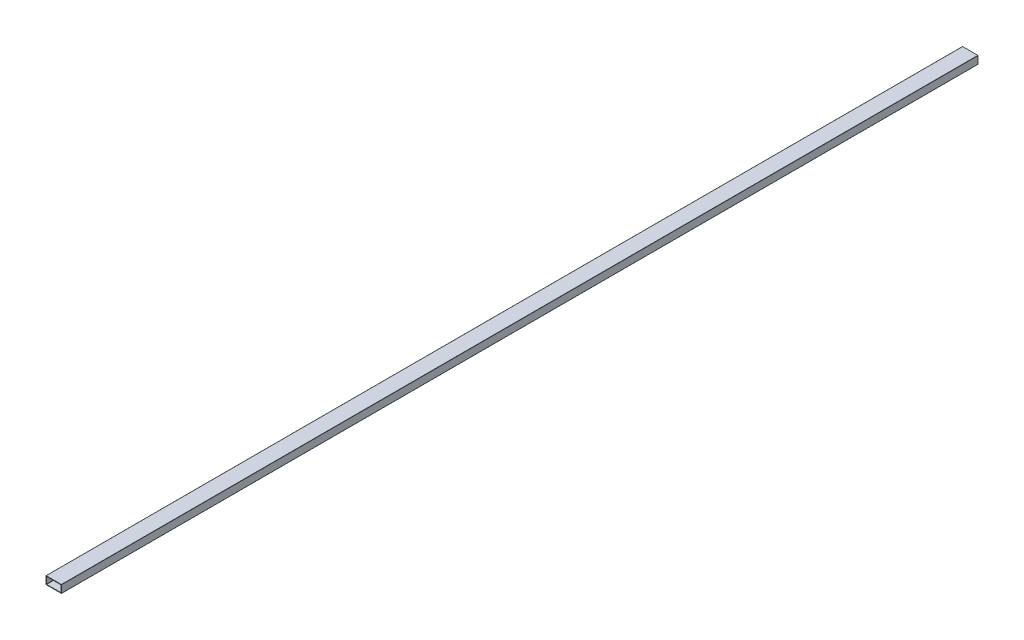
ISO-10303-21;
HEADER;
FILE_DESCRIPTION(('STEP AP214'),'2;1');
FILE_NAME('part.step','',(''),(''),'','','');
FILE_SCHEMA(('AUTOMOTIVE_DESIGN { 1 0 10303 214 1 1 1 1 }'));
ENDSEC;
DATA;
#1=APPLICATION_CONTEXT('core data for automotive mechanical design processes');
#2=APPLICATION_PROTOCOL_DEFINITION('international standard','automotive_design',2000,#1);
#3=PRODUCT_CONTEXT('',#1,'mechanical');
#4=PRODUCT('Part','Part','',(#3));
#5=PRODUCT_RELATED_PRODUCT_CATEGORY('part','',(#4));
#6=PRODUCT_DEFINITION_FORMATION('','',#4);
#7=PRODUCT_DEFINITION_CONTEXT('part definition',#1,'design');
#8=PRODUCT_DEFINITION('design','',#6,#7);
#9=PRODUCT_DEFINITION_SHAPE('','',#8);
#10=(LENGTH_UNIT() NAMED_UNIT(*) SI_UNIT(.MILLI.,.METRE.));
#11=(NAMED_UNIT(*) PLANE_ANGLE_UNIT() SI_UNIT($,.RADIAN.));
#12=(NAMED_UNIT(*) SI_UNIT($,.STERADIAN.) SOLID_ANGLE_UNIT());
#13=UNCERTAINTY_MEASURE_WITH_UNIT(LENGTH_MEASURE(1.E-05),#10,'distance_accuracy_value','');
#14=(GEOMETRIC_REPRESENTATION_CONTEXT(3) GLOBAL_UNCERTAINTY_ASSIGNED_CONTEXT((#13)) GLOBAL_UNIT_ASSIGNED_CONTEXT((#10,
#11,#12)) REPRESENTATION_CONTEXT('',''));
#15=CARTESIAN_POINT('',(0.,0.,0.));
#16=DIRECTION('',(0.,0.,1.));
#17=DIRECTION('',(1.,0.,0.));
#18=AXIS2_PLACEMENT_3D('',#15,#16,#17);
#19=CARTESIAN_POINT('',(50.8,-25.4,-6000.));
#20=DIRECTION('',(1.,0.,0.));
#21=DIRECTION('',(0.,0.,-1.));
#22=AXIS2_PLACEMENT_3D('',#19,#20,#21);
#23=PLANE('',#22);
#24=DIRECTION('',(0.,1.,0.));
#25=VECTOR('',#24,1.);
#26=CARTESIAN_POINT('',(50.8,-25.4,0.));
#27=LINE('',#26,#25);
#28=CARTESIAN_POINT('',(50.8,-24.4,0.));
#29=VERTEX_POINT('',#28);
#30=CARTESIAN_POINT('',(50.8,24.4,0.));
#31=VERTEX_POINT('',#30);
#32=EDGE_CURVE('E197',#29,#31,#27,.T.);
#33=ORIENTED_EDGE('',*,*,#32,.F.);
#34=DIRECTION('',(0.,0.,1.));
#35=VECTOR('',#34,1.);
#36=CARTESIAN_POINT('',(50.8,-24.4,-6000.));
#37=LINE('',#36,#35);
#38=CARTESIAN_POINT('',(50.8,-24.4,-6000.));
#39=VERTEX_POINT('',#38);
#40=EDGE_CURVE('E158',#29,#39,#37,.F.);
#41=ORIENTED_EDGE('',*,*,#40,.T.);
#42=DIRECTION('',(0.,1.,0.));
#43=VECTOR('',#42,1.);
#44=CARTESIAN_POINT('',(50.8,-25.4,-6000.));
#45=LINE('',#44,#43);
#46=CARTESIAN_POINT('',(50.8,24.4,-6000.));
#47=VERTEX_POINT('',#46);
#48=EDGE_CURVE('E185',#39,#47,#45,.T.);
#49=ORIENTED_EDGE('',*,*,#48,.T.);
#50=DIRECTION('',(0.,0.,1.));
#51=VECTOR('',#50,1.);
#52=CARTESIAN_POINT('',(50.8,24.4,-6000.));
#53=LINE('',#52,#51);
#54=EDGE_CURVE('E251',#47,#31,#53,.T.);
#55=ORIENTED_EDGE('',*,*,#54,.T.);
#56=EDGE_LOOP('',(#33,#41,#49,#55));
#57=FACE_BOUND('',#56,.T.);
#58=ADVANCED_FACE('F33',(#57),#23,.T.);
#59=CARTESIAN_POINT('',(-50.8,-25.4,-6000.));
#60=DIRECTION('',(0.,-1.,0.));
#61=DIRECTION('',(0.,0.,-1.));
#62=AXIS2_PLACEMENT_3D('',#59,#60,#61);
#63=PLANE('',#62);
#64=DIRECTION('',(1.,0.,0.));
#65=VECTOR('',#64,1.);
#66=CARTESIAN_POINT('',(-50.8,-25.4,0.));
#67=LINE('',#66,#65);
#68=CARTESIAN_POINT('',(-49.8,-25.4,0.));
#69=VERTEX_POINT('',#68);
#70=CARTESIAN_POINT('',(49.8,-25.4,0.));
#71=VERTEX_POINT('',#70);
#72=EDGE_CURVE('E189',#69,#71,#67,.T.);
#73=ORIENTED_EDGE('',*,*,#72,.F.);
#74=DIRECTION('',(0.,0.,1.));
#75=VECTOR('',#74,1.);
#76=CARTESIAN_POINT('',(-49.8,-25.4,-6000.));
#77=LINE('',#76,#75);
#78=CARTESIAN_POINT('',(-49.8,-25.4,-6000.));
#79=VERTEX_POINT('',#78);
#80=EDGE_CURVE('E238',#69,#79,#77,.F.);
#81=ORIENTED_EDGE('',*,*,#80,.T.);
#82=DIRECTION('',(1.,0.,0.));
#83=VECTOR('',#82,1.);
#84=CARTESIAN_POINT('',(-50.8,-25.4,-6000.));
#85=LINE('',#84,#83);
#86=CARTESIAN_POINT('',(49.8,-25.4,-6000.));
#87=VERTEX_POINT('',#86);
#88=EDGE_CURVE('E194',#79,#87,#85,.T.);
#89=ORIENTED_EDGE('',*,*,#88,.T.);
#90=DIRECTION('',(0.,0.,1.));
#91=VECTOR('',#90,1.);
#92=CARTESIAN_POINT('',(49.8,-25.4,-6000.));
#93=LINE('',#92,#91);
#94=EDGE_CURVE('E235',#87,#71,#93,.T.);
#95=ORIENTED_EDGE('',*,*,#94,.T.);
#96=EDGE_LOOP('',(#73,#81,#89,#95));
#97=FACE_BOUND('',#96,.T.);
#98=ADVANCED_FACE('F305',(#97),#63,.T.);
#99=CARTESIAN_POINT('',(-50.8,-25.4,-6000.));
#100=DIRECTION('',(-1.,0.,0.));
#101=DIRECTION('',(0.,0.,1.));
#102=AXIS2_PLACEMENT_3D('',#99,#100,#101);
#103=PLANE('',#102);
#104=DIRECTION('',(0.,-1.,0.));
#105=VECTOR('',#104,1.);
#106=CARTESIAN_POINT('',(-50.8,-25.4,-6000.));
#107=LINE('',#106,#105);
#108=CARTESIAN_POINT('',(-50.8,24.4,-6000.));
#109=VERTEX_POINT('',#108);
#110=CARTESIAN_POINT('',(-50.8,-24.4,-6000.));
#111=VERTEX_POINT('',#110);
#112=EDGE_CURVE('E191',#109,#111,#107,.T.);
#113=ORIENTED_EDGE('',*,*,#112,.T.);
#114=DIRECTION('',(0.,0.,1.));
#115=VECTOR('',#114,1.);
#116=CARTESIAN_POINT('',(-50.8,-24.4,-6000.));
#117=LINE('',#116,#115);
#118=CARTESIAN_POINT('',(-50.8,-24.4,0.));
#119=VERTEX_POINT('',#118);
#120=EDGE_CURVE('E224',#111,#119,#117,.T.);
#121=ORIENTED_EDGE('',*,*,#120,.T.);
#122=DIRECTION('',(0.,-1.,0.));
#123=VECTOR('',#122,1.);
#124=CARTESIAN_POINT('',(-50.8,-25.4,0.));
#125=LINE('',#124,#123);
#126=CARTESIAN_POINT('',(-50.8,24.4,0.));
#127=VERTEX_POINT('',#126);
#128=EDGE_CURVE('E203',#127,#119,#125,.T.);
#129=ORIENTED_EDGE('',*,*,#128,.F.);
#130=DIRECTION('',(0.,0.,1.));
#131=VECTOR('',#130,1.);
#132=CARTESIAN_POINT('',(-50.8,24.4,-6000.));
#133=LINE('',#132,#131);
#134=EDGE_CURVE('E222',#127,#109,#133,.F.);
#135=ORIENTED_EDGE('',*,*,#134,.T.);
#136=EDGE_LOOP('',(#113,#121,#129,#135));
#137=FACE_BOUND('',#136,.T.);
#138=ADVANCED_FACE('F311',(#137),#103,.T.);
#139=CARTESIAN_POINT('',(-50.8,25.4,-6000.));
#140=DIRECTION('',(0.,1.,0.));
#141=DIRECTION('',(0.,0.,1.));
#142=AXIS2_PLACEMENT_3D('',#139,#140,#141);
#143=PLANE('',#142);
#144=DIRECTION('',(-1.,0.,0.));
#145=VECTOR('',#144,1.);
#146=CARTESIAN_POINT('',(-50.8,25.4,-6000.));
#147=LINE('',#146,#145);
#148=CARTESIAN_POINT('',(49.8,25.4,-6000.));
#149=VERTEX_POINT('',#148);
#150=CARTESIAN_POINT('',(-49.8,25.4,-6000.));
#151=VERTEX_POINT('',#150);
#152=EDGE_CURVE('E188',#149,#151,#147,.T.);
#153=ORIENTED_EDGE('',*,*,#152,.T.);
#154=DIRECTION('',(0.,0.,1.));
#155=VECTOR('',#154,1.);
#156=CARTESIAN_POINT('',(-49.8,25.4,-6000.));
#157=LINE('',#156,#155);
#158=CARTESIAN_POINT('',(-49.8,25.4,0.));
#159=VERTEX_POINT('',#158);
#160=EDGE_CURVE('E248',#151,#159,#157,.T.);
#161=ORIENTED_EDGE('',*,*,#160,.T.);
#162=DIRECTION('',(-1.,0.,0.));
#163=VECTOR('',#162,1.);
#164=CARTESIAN_POINT('',(-50.8,25.4,0.));
#165=LINE('',#164,#163);
#166=CARTESIAN_POINT('',(49.8,25.4,0.));
#167=VERTEX_POINT('',#166);
#168=EDGE_CURVE('E200',#167,#159,#165,.T.);
#169=ORIENTED_EDGE('',*,*,#168,.F.);
#170=DIRECTION('',(0.,0.,1.));
#171=VECTOR('',#170,1.);
#172=CARTESIAN_POINT('',(49.8,25.4,-6000.));
#173=LINE('',#172,#171);
#174=EDGE_CURVE('E55',#167,#149,#173,.F.);
#175=ORIENTED_EDGE('',*,*,#174,.T.);
#176=EDGE_LOOP('',(#153,#161,#169,#175));
#177=FACE_BOUND('',#176,.T.);
#178=ADVANCED_FACE('F316',(#177),#143,.T.);
#179=CARTESIAN_POINT('',(0.,0.,-6000.));
#180=DIRECTION('',(0.,0.,-1.));
#181=DIRECTION('',(-1.,0.,0.));
#182=AXIS2_PLACEMENT_3D('',#179,#180,#181);
#183=PLANE('',#182);
#184=DIRECTION('',(0.,-1.,0.));
#185=VECTOR('',#184,1.);
#186=CARTESIAN_POINT('',(-47.76,-22.36,-6000.));
#187=LINE('',#186,#185);
#188=CARTESIAN_POINT('',(-47.76,21.36,-6000.));
#189=VERTEX_POINT('',#188);
#190=CARTESIAN_POINT('',(-47.76,-21.36,-6000.));
#191=VERTEX_POINT('',#190);
#192=EDGE_CURVE('E167',#189,#191,#187,.T.);
#193=ORIENTED_EDGE('',*,*,#192,.T.);
#194=CARTESIAN_POINT('',(-46.76,-21.36,-6000.));
#195=DIRECTION('',(0.,0.,-1.));
#196=DIRECTION('',(-1.,0.,0.));
#197=AXIS2_PLACEMENT_3D('',#194,#195,#196);
#198=CIRCLE('',#197,1.);
#199=CARTESIAN_POINT('',(-46.76,-22.36,-6000.));
#200=VERTEX_POINT('',#199);
#201=EDGE_CURVE('E11',#191,#200,#198,.F.);
#202=ORIENTED_EDGE('',*,*,#201,.T.);
#203=DIRECTION('',(1.,0.,0.));
#204=VECTOR('',#203,1.);
#205=CARTESIAN_POINT('',(-47.76,-22.36,-6000.));
#206=LINE('',#205,#204);
#207=CARTESIAN_POINT('',(46.76,-22.36,-6000.));
#208=VERTEX_POINT('',#207);
#209=EDGE_CURVE('E175',#200,#208,#206,.T.);
#210=ORIENTED_EDGE('',*,*,#209,.T.);
#211=CARTESIAN_POINT('',(46.76,-21.36,-6000.));
#212=DIRECTION('',(0.,0.,-1.));
#213=DIRECTION('',(-1.,0.,0.));
#214=AXIS2_PLACEMENT_3D('',#211,#212,#213);
#215=CIRCLE('',#214,1.);
#216=CARTESIAN_POINT('',(47.76,-21.36,-6000.));
#217=VERTEX_POINT('',#216);
#218=EDGE_CURVE('E262',#208,#217,#215,.F.);
#219=ORIENTED_EDGE('',*,*,#218,.T.);
#220=DIRECTION('',(0.,1.,0.));
#221=VECTOR('',#220,1.);
#222=CARTESIAN_POINT('',(47.76,-22.36,-6000.));
#223=LINE('',#222,#221);
#224=CARTESIAN_POINT('',(47.76,21.36,-6000.));
#225=VERTEX_POINT('',#224);
#226=EDGE_CURVE('E179',#217,#225,#223,.T.);
#227=ORIENTED_EDGE('',*,*,#226,.T.);
#228=CARTESIAN_POINT('',(46.76,21.36,-6000.));
#229=DIRECTION('',(0.,0.,-1.));
#230=DIRECTION('',(-1.,0.,0.));
#231=AXIS2_PLACEMENT_3D('',#228,#229,#230);
#232=CIRCLE('',#231,1.);
#233=CARTESIAN_POINT('',(46.76,22.36,-6000.));
#234=VERTEX_POINT('',#233);
#235=EDGE_CURVE('E258',#225,#234,#232,.F.);
#236=ORIENTED_EDGE('',*,*,#235,.T.);
#237=DIRECTION('',(-1.,0.,0.));
#238=VECTOR('',#237,1.);
#239=CARTESIAN_POINT('',(-47.76,22.36,-6000.));
#240=LINE('',#239,#238);
#241=CARTESIAN_POINT('',(-46.76,22.36,-6000.));
#242=VERTEX_POINT('',#241);
#243=EDGE_CURVE('E277',#234,#242,#240,.T.);
#244=ORIENTED_EDGE('',*,*,#243,.T.);
#245=CARTESIAN_POINT('',(-46.76,21.36,-6000.));
#246=DIRECTION('',(0.,0.,-1.));
#247=DIRECTION('',(-1.,0.,0.));
#248=AXIS2_PLACEMENT_3D('',#245,#246,#247);
#249=CIRCLE('',#248,1.);
#250=EDGE_CURVE('E157',#242,#189,#249,.F.);
#251=ORIENTED_EDGE('',*,*,#250,.T.);
#252=EDGE_LOOP('',(#193,#202,#210,#219,#227,#236,#244,#251));
#253=FACE_BOUND('',#252,.T.);
#254=ORIENTED_EDGE('',*,*,#88,.F.);
#255=CARTESIAN_POINT('',(-49.8,-24.4,-6000.));
#256=DIRECTION('',(0.,0.,-1.));
#257=DIRECTION('',(-1.,0.,0.));
#258=AXIS2_PLACEMENT_3D('',#255,#256,#257);
#259=CIRCLE('',#258,1.);
#260=EDGE_CURVE('E245',#79,#111,#259,.T.);
#261=ORIENTED_EDGE('',*,*,#260,.T.);
#262=ORIENTED_EDGE('',*,*,#112,.F.);
#263=CARTESIAN_POINT('',(-49.8,24.4,-6000.));
#264=DIRECTION('',(0.,0.,-1.));
#265=DIRECTION('',(-1.,0.,0.));
#266=AXIS2_PLACEMENT_3D('',#263,#264,#265);
#267=CIRCLE('',#266,1.);
#268=EDGE_CURVE('E48',#109,#151,#267,.T.);
#269=ORIENTED_EDGE('',*,*,#268,.T.);
#270=ORIENTED_EDGE('',*,*,#152,.F.);
#271=CARTESIAN_POINT('',(49.8,24.4,-6000.));
#272=DIRECTION('',(0.,0.,-1.));
#273=DIRECTION('',(-1.,0.,0.));
#274=AXIS2_PLACEMENT_3D('',#271,#272,#273);
#275=CIRCLE('',#274,1.);
#276=EDGE_CURVE('E240',#149,#47,#275,.T.);
#277=ORIENTED_EDGE('',*,*,#276,.T.);
#278=ORIENTED_EDGE('',*,*,#48,.F.);
#279=CARTESIAN_POINT('',(49.8,-24.4,-6000.));
#280=DIRECTION('',(0.,0.,-1.));
#281=DIRECTION('',(-1.,0.,0.));
#282=AXIS2_PLACEMENT_3D('',#279,#280,#281);
#283=CIRCLE('',#282,1.);
#284=EDGE_CURVE('E242',#39,#87,#283,.T.);
#285=ORIENTED_EDGE('',*,*,#284,.T.);
#286=EDGE_LOOP('',(#254,#261,#262,#269,#270,#277,#278,#285));
#287=FACE_BOUND('',#286,.T.);
#288=ADVANCED_FACE('F267',(#253,#287),#183,.T.);
#289=CARTESIAN_POINT('',(0.,0.,0.));
#290=DIRECTION('',(0.,0.,-1.));
#291=DIRECTION('',(-1.,0.,0.));
#292=AXIS2_PLACEMENT_3D('',#289,#290,#291);
#293=PLANE('',#292);
#294=DIRECTION('',(0.,1.,0.));
#295=VECTOR('',#294,1.);
#296=CARTESIAN_POINT('',(47.76,-22.36,0.));
#297=LINE('',#296,#295);
#298=CARTESIAN_POINT('',(47.76,-21.36,0.));
#299=VERTEX_POINT('',#298);
#300=CARTESIAN_POINT('',(47.76,21.36,0.));
#301=VERTEX_POINT('',#300);
#302=EDGE_CURVE('E181',#299,#301,#297,.T.);
#303=ORIENTED_EDGE('',*,*,#302,.F.);
#304=CARTESIAN_POINT('',(46.76,-21.36,0.));
#305=DIRECTION('',(0.,0.,-1.));
#306=DIRECTION('',(-1.,0.,0.));
#307=AXIS2_PLACEMENT_3D('',#304,#305,#306);
#308=CIRCLE('',#307,1.);
#309=CARTESIAN_POINT('',(46.76,-22.36,0.));
#310=VERTEX_POINT('',#309);
#311=EDGE_CURVE('E260',#299,#310,#308,.T.);
#312=ORIENTED_EDGE('',*,*,#311,.T.);
#313=DIRECTION('',(1.,0.,0.));
#314=VECTOR('',#313,1.);
#315=CARTESIAN_POINT('',(-47.76,-22.36,0.));
#316=LINE('',#315,#314);
#317=CARTESIAN_POINT('',(-46.76,-22.36,0.));
#318=VERTEX_POINT('',#317);
#319=EDGE_CURVE('E281',#318,#310,#316,.T.);
#320=ORIENTED_EDGE('',*,*,#319,.F.);
#321=CARTESIAN_POINT('',(-46.76,-21.36,0.));
#322=DIRECTION('',(0.,0.,-1.));
#323=DIRECTION('',(-1.,0.,0.));
#324=AXIS2_PLACEMENT_3D('',#321,#322,#323);
#325=CIRCLE('',#324,1.);
#326=CARTESIAN_POINT('',(-47.76,-21.36,0.));
#327=VERTEX_POINT('',#326);
#328=EDGE_CURVE('E41',#318,#327,#325,.T.);
#329=ORIENTED_EDGE('',*,*,#328,.T.);
#330=DIRECTION('',(0.,-1.,0.));
#331=VECTOR('',#330,1.);
#332=CARTESIAN_POINT('',(-47.76,-22.36,0.));
#333=LINE('',#332,#331);
#334=CARTESIAN_POINT('',(-47.76,21.36,0.));
#335=VERTEX_POINT('',#334);
#336=EDGE_CURVE('E164',#335,#327,#333,.T.);
#337=ORIENTED_EDGE('',*,*,#336,.F.);
#338=CARTESIAN_POINT('',(-46.76,21.36,0.));
#339=DIRECTION('',(0.,0.,-1.));
#340=DIRECTION('',(-1.,0.,0.));
#341=AXIS2_PLACEMENT_3D('',#338,#339,#340);
#342=CIRCLE('',#341,1.);
#343=CARTESIAN_POINT('',(-46.76,22.36,0.));
#344=VERTEX_POINT('',#343);
#345=EDGE_CURVE('E147',#335,#344,#342,.T.);
#346=ORIENTED_EDGE('',*,*,#345,.T.);
#347=DIRECTION('',(-1.,0.,0.));
#348=VECTOR('',#347,1.);
#349=CARTESIAN_POINT('',(-47.76,22.36,0.));
#350=LINE('',#349,#348);
#351=CARTESIAN_POINT('',(46.76,22.36,0.));
#352=VERTEX_POINT('',#351);
#353=EDGE_CURVE('E176',#352,#344,#350,.T.);
#354=ORIENTED_EDGE('',*,*,#353,.F.);
#355=CARTESIAN_POINT('',(46.76,21.36,0.));
#356=DIRECTION('',(0.,0.,-1.));
#357=DIRECTION('',(-1.,0.,0.));
#358=AXIS2_PLACEMENT_3D('',#355,#356,#357);
#359=CIRCLE('',#358,1.);
#360=EDGE_CURVE('E256',#352,#301,#359,.T.);
#361=ORIENTED_EDGE('',*,*,#360,.T.);
#362=EDGE_LOOP('',(#303,#312,#320,#329,#337,#346,#354,#361));
#363=FACE_BOUND('',#362,.T.);
#364=ORIENTED_EDGE('',*,*,#128,.T.);
#365=CARTESIAN_POINT('',(-49.8,-24.4,0.));
#366=DIRECTION('',(0.,0.,-1.));
#367=DIRECTION('',(-1.,0.,0.));
#368=AXIS2_PLACEMENT_3D('',#365,#366,#367);
#369=CIRCLE('',#368,1.);
#370=EDGE_CURVE('E233',#119,#69,#369,.F.);
#371=ORIENTED_EDGE('',*,*,#370,.T.);
#372=ORIENTED_EDGE('',*,*,#72,.T.);
#373=CARTESIAN_POINT('',(49.8,-24.4,0.));
#374=DIRECTION('',(0.,0.,-1.));
#375=DIRECTION('',(-1.,0.,0.));
#376=AXIS2_PLACEMENT_3D('',#373,#374,#375);
#377=CIRCLE('',#376,1.);
#378=EDGE_CURVE('E229',#71,#29,#377,.F.);
#379=ORIENTED_EDGE('',*,*,#378,.T.);
#380=ORIENTED_EDGE('',*,*,#32,.T.);
#381=CARTESIAN_POINT('',(49.8,24.4,0.));
#382=DIRECTION('',(0.,0.,-1.));
#383=DIRECTION('',(-1.,0.,0.));
#384=AXIS2_PLACEMENT_3D('',#381,#382,#383);
#385=CIRCLE('',#384,1.);
#386=EDGE_CURVE('E227',#31,#167,#385,.F.);
#387=ORIENTED_EDGE('',*,*,#386,.T.);
#388=ORIENTED_EDGE('',*,*,#168,.T.);
#389=CARTESIAN_POINT('',(-49.8,24.4,0.));
#390=DIRECTION('',(0.,0.,-1.));
#391=DIRECTION('',(-1.,0.,0.));
#392=AXIS2_PLACEMENT_3D('',#389,#390,#391);
#393=CIRCLE('',#392,1.);
#394=EDGE_CURVE('E231',#159,#127,#393,.F.);
#395=ORIENTED_EDGE('',*,*,#394,.T.);
#396=EDGE_LOOP('',(#364,#371,#372,#379,#380,#387,#388,#395));
#397=FACE_BOUND('',#396,.T.);
#398=ADVANCED_FACE('F172',(#363,#397),#293,.F.);
#399=CARTESIAN_POINT('',(-47.76,-22.36,-6000.));
#400=DIRECTION('',(0.,-1.,0.));
#401=DIRECTION('',(0.,0.,-1.));
#402=AXIS2_PLACEMENT_3D('',#399,#400,#401);
#403=PLANE('',#402);
#404=ORIENTED_EDGE('',*,*,#319,.T.);
#405=DIRECTION('',(0.,0.,1.));
#406=VECTOR('',#405,1.);
#407=CARTESIAN_POINT('',(46.76,-22.36,-6000.));
#408=LINE('',#407,#406);
#409=EDGE_CURVE('E220',#310,#208,#408,.F.);
#410=ORIENTED_EDGE('',*,*,#409,.T.);
#411=ORIENTED_EDGE('',*,*,#209,.F.);
#412=DIRECTION('',(0.,0.,1.));
#413=VECTOR('',#412,1.);
#414=CARTESIAN_POINT('',(-46.76,-22.36,0.));
#415=LINE('',#414,#413);
#416=EDGE_CURVE('E217',#200,#318,#415,.T.);
#417=ORIENTED_EDGE('',*,*,#416,.T.);
#418=EDGE_LOOP('',(#404,#410,#411,#417));
#419=FACE_BOUND('',#418,.T.);
#420=ADVANCED_FACE('F283',(#419),#403,.F.);
#421=CARTESIAN_POINT('',(-47.76,-22.36,-6000.));
#422=DIRECTION('',(-1.,0.,0.));
#423=DIRECTION('',(0.,0.,1.));
#424=AXIS2_PLACEMENT_3D('',#421,#422,#423);
#425=PLANE('',#424);
#426=ORIENTED_EDGE('',*,*,#192,.F.);
#427=DIRECTION('',(0.,0.,1.));
#428=VECTOR('',#427,1.);
#429=CARTESIAN_POINT('',(-47.76,21.36,0.));
#430=LINE('',#429,#428);
#431=EDGE_CURVE('E151',#189,#335,#430,.T.);
#432=ORIENTED_EDGE('',*,*,#431,.T.);
#433=ORIENTED_EDGE('',*,*,#336,.T.);
#434=DIRECTION('',(0.,0.,1.));
#435=VECTOR('',#434,1.);
#436=CARTESIAN_POINT('',(-47.76,-21.36,-6000.));
#437=LINE('',#436,#435);
#438=EDGE_CURVE('E169',#327,#191,#437,.F.);
#439=ORIENTED_EDGE('',*,*,#438,.T.);
#440=EDGE_LOOP('',(#426,#432,#433,#439));
#441=FACE_BOUND('',#440,.T.);
#442=ADVANCED_FACE('F163',(#441),#425,.F.);
#443=CARTESIAN_POINT('',(-47.76,22.36,-6000.));
#444=DIRECTION('',(0.,1.,0.));
#445=DIRECTION('',(-1.,0.,0.));
#446=AXIS2_PLACEMENT_3D('',#443,#444,#445);
#447=PLANE('',#446);
#448=ORIENTED_EDGE('',*,*,#353,.T.);
#449=DIRECTION('',(0.,0.,1.));
#450=VECTOR('',#449,1.);
#451=CARTESIAN_POINT('',(-46.76,22.36,-6000.));
#452=LINE('',#451,#450);
#453=EDGE_CURVE('E152',#344,#242,#452,.F.);
#454=ORIENTED_EDGE('',*,*,#453,.T.);
#455=ORIENTED_EDGE('',*,*,#243,.F.);
#456=DIRECTION('',(0.,0.,1.));
#457=VECTOR('',#456,1.);
#458=CARTESIAN_POINT('',(46.76,22.36,0.));
#459=LINE('',#458,#457);
#460=EDGE_CURVE('E168',#234,#352,#459,.T.);
#461=ORIENTED_EDGE('',*,*,#460,.T.);
#462=EDGE_LOOP('',(#448,#454,#455,#461));
#463=FACE_BOUND('',#462,.T.);
#464=ADVANCED_FACE('F292',(#463),#447,.F.);
#465=CARTESIAN_POINT('',(47.76,-22.36,-6000.));
#466=DIRECTION('',(1.,0.,0.));
#467=DIRECTION('',(0.,0.,-1.));
#468=AXIS2_PLACEMENT_3D('',#465,#466,#467);
#469=PLANE('',#468);
#470=ORIENTED_EDGE('',*,*,#302,.T.);
#471=DIRECTION('',(0.,0.,1.));
#472=VECTOR('',#471,1.);
#473=CARTESIAN_POINT('',(47.76,21.36,-6000.));
#474=LINE('',#473,#472);
#475=EDGE_CURVE('E215',#301,#225,#474,.F.);
#476=ORIENTED_EDGE('',*,*,#475,.T.);
#477=ORIENTED_EDGE('',*,*,#226,.F.);
#478=DIRECTION('',(0.,0.,1.));
#479=VECTOR('',#478,1.);
#480=CARTESIAN_POINT('',(47.76,-21.36,0.));
#481=LINE('',#480,#479);
#482=EDGE_CURVE('E212',#217,#299,#481,.T.);
#483=ORIENTED_EDGE('',*,*,#482,.T.);
#484=EDGE_LOOP('',(#470,#476,#477,#483));
#485=FACE_BOUND('',#484,.T.);
#486=ADVANCED_FACE('F275',(#485),#469,.F.);
#487=CARTESIAN_POINT('',(-46.76,21.36,-6000.));
#488=DIRECTION('',(0.,0.,-1.));
#489=DIRECTION('',(-1.,0.,0.));
#490=AXIS2_PLACEMENT_3D('',#487,#488,#489);
#491=CYLINDRICAL_SURFACE('',#490,1.);
#492=ORIENTED_EDGE('',*,*,#250,.F.);
#493=ORIENTED_EDGE('',*,*,#453,.F.);
#494=ORIENTED_EDGE('',*,*,#345,.F.);
#495=ORIENTED_EDGE('',*,*,#431,.F.);
#496=EDGE_LOOP('',(#492,#493,#494,#495));
#497=FACE_BOUND('',#496,.T.);
#498=ADVANCED_FACE('F150',(#497),#491,.F.);
#499=CARTESIAN_POINT('',(46.76,21.36,-6000.));
#500=DIRECTION('',(0.,0.,-1.));
#501=DIRECTION('',(-1.,0.,0.));
#502=AXIS2_PLACEMENT_3D('',#499,#500,#501);
#503=CYLINDRICAL_SURFACE('',#502,1.);
#504=ORIENTED_EDGE('',*,*,#235,.F.);
#505=ORIENTED_EDGE('',*,*,#475,.F.);
#506=ORIENTED_EDGE('',*,*,#360,.F.);
#507=ORIENTED_EDGE('',*,*,#460,.F.);
#508=EDGE_LOOP('',(#504,#505,#506,#507));
#509=FACE_BOUND('',#508,.T.);
#510=ADVANCED_FACE('F294',(#509),#503,.F.);
#511=CARTESIAN_POINT('',(46.76,-21.36,-6000.));
#512=DIRECTION('',(0.,0.,-1.));
#513=DIRECTION('',(-1.,0.,0.));
#514=AXIS2_PLACEMENT_3D('',#511,#512,#513);
#515=CYLINDRICAL_SURFACE('',#514,1.);
#516=ORIENTED_EDGE('',*,*,#218,.F.);
#517=ORIENTED_EDGE('',*,*,#409,.F.);
#518=ORIENTED_EDGE('',*,*,#311,.F.);
#519=ORIENTED_EDGE('',*,*,#482,.F.);
#520=EDGE_LOOP('',(#516,#517,#518,#519));
#521=FACE_BOUND('',#520,.T.);
#522=ADVANCED_FACE('F279',(#521),#515,.F.);
#523=CARTESIAN_POINT('',(-49.8,-24.4,-6000.));
#524=DIRECTION('',(0.,0.,1.));
#525=DIRECTION('',(1.,0.,0.));
#526=AXIS2_PLACEMENT_3D('',#523,#524,#525);
#527=CYLINDRICAL_SURFACE('',#526,1.);
#528=ORIENTED_EDGE('',*,*,#260,.F.);
#529=ORIENTED_EDGE('',*,*,#80,.F.);
#530=ORIENTED_EDGE('',*,*,#370,.F.);
#531=ORIENTED_EDGE('',*,*,#120,.F.);
#532=EDGE_LOOP('',(#528,#529,#530,#531));
#533=FACE_BOUND('',#532,.T.);
#534=ADVANCED_FACE('F301',(#533),#527,.T.);
#535=CARTESIAN_POINT('',(-49.8,24.4,-6000.));
#536=DIRECTION('',(0.,0.,1.));
#537=DIRECTION('',(1.,0.,0.));
#538=AXIS2_PLACEMENT_3D('',#535,#536,#537);
#539=CYLINDRICAL_SURFACE('',#538,1.);
#540=ORIENTED_EDGE('',*,*,#268,.F.);
#541=ORIENTED_EDGE('',*,*,#134,.F.);
#542=ORIENTED_EDGE('',*,*,#394,.F.);
#543=ORIENTED_EDGE('',*,*,#160,.F.);
#544=EDGE_LOOP('',(#540,#541,#542,#543));
#545=FACE_BOUND('',#544,.T.);
#546=ADVANCED_FACE('F368',(#545),#539,.T.);
#547=CARTESIAN_POINT('',(-46.76,-21.36,-6000.));
#548=DIRECTION('',(0.,0.,-1.));
#549=DIRECTION('',(-1.,0.,0.));
#550=AXIS2_PLACEMENT_3D('',#547,#548,#549);
#551=CYLINDRICAL_SURFACE('',#550,1.);
#552=ORIENTED_EDGE('',*,*,#201,.F.);
#553=ORIENTED_EDGE('',*,*,#438,.F.);
#554=ORIENTED_EDGE('',*,*,#328,.F.);
#555=ORIENTED_EDGE('',*,*,#416,.F.);
#556=EDGE_LOOP('',(#552,#553,#554,#555));
#557=FACE_BOUND('',#556,.T.);
#558=ADVANCED_FACE('F378',(#557),#551,.F.);
#559=CARTESIAN_POINT('',(49.8,-24.4,-6000.));
#560=DIRECTION('',(0.,0.,1.));
#561=DIRECTION('',(1.,0.,0.));
#562=AXIS2_PLACEMENT_3D('',#559,#560,#561);
#563=CYLINDRICAL_SURFACE('',#562,1.);
#564=ORIENTED_EDGE('',*,*,#284,.F.);
#565=ORIENTED_EDGE('',*,*,#40,.F.);
#566=ORIENTED_EDGE('',*,*,#378,.F.);
#567=ORIENTED_EDGE('',*,*,#94,.F.);
#568=EDGE_LOOP('',(#564,#565,#566,#567));
#569=FACE_BOUND('',#568,.T.);
#570=ADVANCED_FACE('F388',(#569),#563,.T.);
#571=CARTESIAN_POINT('',(49.8,24.4,-6000.));
#572=DIRECTION('',(0.,0.,1.));
#573=DIRECTION('',(1.,0.,0.));
#574=AXIS2_PLACEMENT_3D('',#571,#572,#573);
#575=CYLINDRICAL_SURFACE('',#574,1.);
#576=ORIENTED_EDGE('',*,*,#276,.F.);
#577=ORIENTED_EDGE('',*,*,#174,.F.);
#578=ORIENTED_EDGE('',*,*,#386,.F.);
#579=ORIENTED_EDGE('',*,*,#54,.F.);
#580=EDGE_LOOP('',(#576,#577,#578,#579));
#581=FACE_BOUND('',#580,.T.);
#582=ADVANCED_FACE('F35',(#581),#575,.T.);
#583=CLOSED_SHELL('',(#58,#98,#138,#178,#288,#398,#420,#442,#464,#486,#498,#510,#522,#534,#546,
#558,#570,#582));
#584=MANIFOLD_SOLID_BREP('B2',#583);
#585=ADVANCED_BREP_SHAPE_REPRESENTATION('',(#18,#584),#14);
#586=SHAPE_DEFINITION_REPRESENTATION(#9,#585);
ENDSEC;
END-ISO-10303-21;
